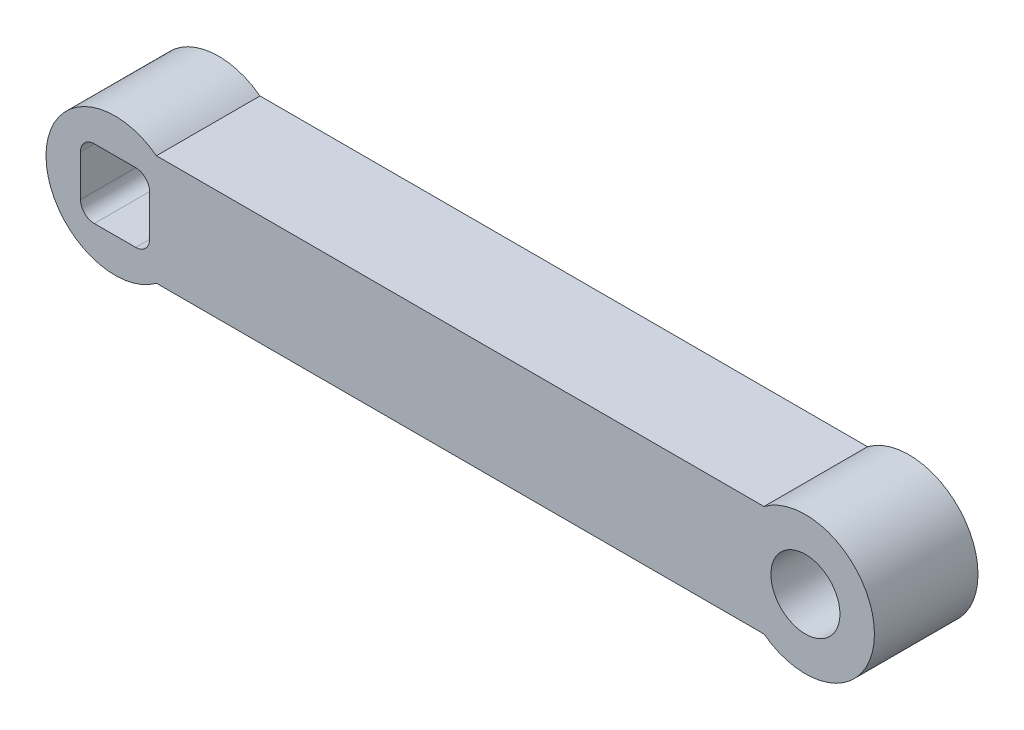
ISO-10303-21;
HEADER;
FILE_DESCRIPTION(('STEP AP214'),'2;1');
FILE_NAME('part.step','',(''),(''),'','','');
FILE_SCHEMA(('AUTOMOTIVE_DESIGN { 1 0 10303 214 1 1 1 1 }'));
ENDSEC;
DATA;
#1=APPLICATION_CONTEXT('core data for automotive mechanical design processes');
#2=APPLICATION_PROTOCOL_DEFINITION('international standard','automotive_design',2000,#1);
#3=PRODUCT_CONTEXT('',#1,'mechanical');
#4=PRODUCT('Part','Part','',(#3));
#5=PRODUCT_RELATED_PRODUCT_CATEGORY('part','',(#4));
#6=PRODUCT_DEFINITION_FORMATION('','',#4);
#7=PRODUCT_DEFINITION_CONTEXT('part definition',#1,'design');
#8=PRODUCT_DEFINITION('design','',#6,#7);
#9=PRODUCT_DEFINITION_SHAPE('','',#8);
#10=(LENGTH_UNIT() NAMED_UNIT(*) SI_UNIT(.MILLI.,.METRE.));
#11=(NAMED_UNIT(*) PLANE_ANGLE_UNIT() SI_UNIT($,.RADIAN.));
#12=(NAMED_UNIT(*) SI_UNIT($,.STERADIAN.) SOLID_ANGLE_UNIT());
#13=UNCERTAINTY_MEASURE_WITH_UNIT(LENGTH_MEASURE(1.E-05),#10,'distance_accuracy_value','');
#14=(GEOMETRIC_REPRESENTATION_CONTEXT(3) GLOBAL_UNCERTAINTY_ASSIGNED_CONTEXT((#13)) GLOBAL_UNIT_ASSIGNED_CONTEXT((#10,
#11,#12)) REPRESENTATION_CONTEXT('',''));
#15=CARTESIAN_POINT('',(0.,0.,0.));
#16=DIRECTION('',(0.,0.,1.));
#17=DIRECTION('',(1.,0.,0.));
#18=AXIS2_PLACEMENT_3D('',#15,#16,#17);
#19=CARTESIAN_POINT('',(0.,0.,7.5));
#20=DIRECTION('',(0.,0.,1.));
#21=DIRECTION('',(1.,0.,0.));
#22=AXIS2_PLACEMENT_3D('',#19,#20,#21);
#23=PLANE('',#22);
#24=CARTESIAN_POINT('',(0.,0.,7.5));
#25=DIRECTION('',(0.,0.,1.));
#26=DIRECTION('',(1.,0.,0.));
#27=AXIS2_PLACEMENT_3D('',#24,#25,#26);
#28=CIRCLE('',#27,5.);
#29=CARTESIAN_POINT('',(-3.00000000000002,-3.99999999999998,7.5));
#30=VERTEX_POINT('',#29);
#31=CARTESIAN_POINT('',(-3.00000000000002,3.99999999999998,7.5));
#32=VERTEX_POINT('',#31);
#33=EDGE_CURVE('E197',#30,#32,#28,.T.);
#34=ORIENTED_EDGE('',*,*,#33,.T.);
#35=DIRECTION('',(-1.,0.,0.));
#36=VECTOR('',#35,1.);
#37=CARTESIAN_POINT('',(-47.,3.99999999999998,7.5));
#38=LINE('',#37,#36);
#39=CARTESIAN_POINT('',(-47.,3.99999999999998,7.5));
#40=VERTEX_POINT('',#39);
#41=EDGE_CURVE('E200',#32,#40,#38,.T.);
#42=ORIENTED_EDGE('',*,*,#41,.T.);
#43=CARTESIAN_POINT('',(-50.,0.,7.5));
#44=DIRECTION('',(0.,0.,1.));
#45=DIRECTION('',(1.,0.,0.));
#46=AXIS2_PLACEMENT_3D('',#43,#44,#45);
#47=CIRCLE('',#46,5.);
#48=CARTESIAN_POINT('',(-47.,-3.99999999999999,7.5));
#49=VERTEX_POINT('',#48);
#50=EDGE_CURVE('E203',#40,#49,#47,.T.);
#51=ORIENTED_EDGE('',*,*,#50,.T.);
#52=DIRECTION('',(1.,0.,0.));
#53=VECTOR('',#52,1.);
#54=CARTESIAN_POINT('',(-47.,-3.99999999999999,7.5));
#55=LINE('',#54,#53);
#56=EDGE_CURVE('E205',#49,#30,#55,.T.);
#57=ORIENTED_EDGE('',*,*,#56,.T.);
#58=EDGE_LOOP('',(#34,#42,#51,#57));
#59=FACE_BOUND('',#58,.T.);
#60=CARTESIAN_POINT('',(0.,0.,7.5));
#61=DIRECTION('',(0.,0.,1.));
#62=DIRECTION('',(1.,0.,0.));
#63=AXIS2_PLACEMENT_3D('',#60,#61,#62);
#64=CIRCLE('',#63,2.5);
#65=CARTESIAN_POINT('',(2.5,0.,7.5));
#66=VERTEX_POINT('',#65);
#67=EDGE_CURVE('E191',#66,#66,#64,.T.);
#68=ORIENTED_EDGE('',*,*,#67,.F.);
#69=EDGE_LOOP('',(#68));
#70=FACE_BOUND('',#69,.T.);
#71=DIRECTION('',(0.,1.,0.));
#72=VECTOR('',#71,1.);
#73=CARTESIAN_POINT('',(-47.5,-1.50000000000001,7.5));
#74=LINE('',#73,#72);
#75=CARTESIAN_POINT('',(-47.5,-1.50000000000001,7.5));
#76=VERTEX_POINT('',#75);
#77=CARTESIAN_POINT('',(-47.5,1.49999999999999,7.5));
#78=VERTEX_POINT('',#77);
#79=EDGE_CURVE('E134',#76,#78,#74,.T.);
#80=ORIENTED_EDGE('',*,*,#79,.F.);
#81=CARTESIAN_POINT('',(-48.5,-1.50000000000001,7.5));
#82=DIRECTION('',(0.,0.,1.));
#83=DIRECTION('',(1.,0.,0.));
#84=AXIS2_PLACEMENT_3D('',#81,#82,#83);
#85=CIRCLE('',#84,1.);
#86=CARTESIAN_POINT('',(-48.5,-2.50000000000001,7.5));
#87=VERTEX_POINT('',#86);
#88=EDGE_CURVE('E126',#87,#76,#85,.T.);
#89=ORIENTED_EDGE('',*,*,#88,.F.);
#90=DIRECTION('',(1.,0.,0.));
#91=VECTOR('',#90,1.);
#92=CARTESIAN_POINT('',(-51.5,-2.50000000000001,7.5));
#93=LINE('',#92,#91);
#94=CARTESIAN_POINT('',(-51.5,-2.50000000000001,7.5));
#95=VERTEX_POINT('',#94);
#96=EDGE_CURVE('E159',#95,#87,#93,.T.);
#97=ORIENTED_EDGE('',*,*,#96,.F.);
#98=CARTESIAN_POINT('',(-51.5,-1.50000000000001,7.5));
#99=DIRECTION('',(0.,0.,1.));
#100=DIRECTION('',(-1.,0.,0.));
#101=AXIS2_PLACEMENT_3D('',#98,#99,#100);
#102=CIRCLE('',#101,1.);
#103=CARTESIAN_POINT('',(-52.5,-1.50000000000001,7.5));
#104=VERTEX_POINT('',#103);
#105=EDGE_CURVE('E157',#104,#95,#102,.T.);
#106=ORIENTED_EDGE('',*,*,#105,.F.);
#107=DIRECTION('',(0.,-1.,0.));
#108=VECTOR('',#107,1.);
#109=CARTESIAN_POINT('',(-52.5,-1.50000000000001,7.5));
#110=LINE('',#109,#108);
#111=CARTESIAN_POINT('',(-52.5,1.49999999999999,7.5));
#112=VERTEX_POINT('',#111);
#113=EDGE_CURVE('E155',#112,#104,#110,.T.);
#114=ORIENTED_EDGE('',*,*,#113,.F.);
#115=CARTESIAN_POINT('',(-51.5,1.49999999999999,7.5));
#116=DIRECTION('',(0.,0.,1.));
#117=DIRECTION('',(-1.,0.,0.));
#118=AXIS2_PLACEMENT_3D('',#115,#116,#117);
#119=CIRCLE('',#118,1.);
#120=CARTESIAN_POINT('',(-51.5,2.49999999999999,7.5));
#121=VERTEX_POINT('',#120);
#122=EDGE_CURVE('E153',#121,#112,#119,.T.);
#123=ORIENTED_EDGE('',*,*,#122,.F.);
#124=DIRECTION('',(-1.,0.,0.));
#125=VECTOR('',#124,1.);
#126=CARTESIAN_POINT('',(-51.5,2.49999999999999,7.5));
#127=LINE('',#126,#125);
#128=CARTESIAN_POINT('',(-48.5,2.49999999999999,7.5));
#129=VERTEX_POINT('',#128);
#130=EDGE_CURVE('E149',#129,#121,#127,.T.);
#131=ORIENTED_EDGE('',*,*,#130,.F.);
#132=CARTESIAN_POINT('',(-48.5,1.49999999999999,7.5));
#133=DIRECTION('',(0.,0.,1.));
#134=DIRECTION('',(-1.,0.,0.));
#135=AXIS2_PLACEMENT_3D('',#132,#133,#134);
#136=CIRCLE('',#135,1.);
#137=EDGE_CURVE('E147',#78,#129,#136,.T.);
#138=ORIENTED_EDGE('',*,*,#137,.F.);
#139=EDGE_LOOP('',(#80,#89,#97,#106,#114,#123,#131,#138));
#140=FACE_BOUND('',#139,.T.);
#141=ADVANCED_FACE('F37',(#59,#70,#140),#23,.T.);
#142=CARTESIAN_POINT('',(0.,0.,0.));
#143=DIRECTION('',(0.,0.,1.));
#144=DIRECTION('',(1.,0.,0.));
#145=AXIS2_PLACEMENT_3D('',#142,#143,#144);
#146=PLANE('',#145);
#147=CARTESIAN_POINT('',(0.,0.,0.));
#148=DIRECTION('',(0.,0.,1.));
#149=DIRECTION('',(1.,0.,0.));
#150=AXIS2_PLACEMENT_3D('',#147,#148,#149);
#151=CIRCLE('',#150,2.5);
#152=CARTESIAN_POINT('',(2.5,0.,0.));
#153=VERTEX_POINT('',#152);
#154=EDGE_CURVE('E142',#153,#153,#151,.T.);
#155=ORIENTED_EDGE('',*,*,#154,.T.);
#156=EDGE_LOOP('',(#155));
#157=FACE_BOUND('',#156,.T.);
#158=CARTESIAN_POINT('',(0.,0.,0.));
#159=DIRECTION('',(0.,0.,1.));
#160=DIRECTION('',(1.,0.,0.));
#161=AXIS2_PLACEMENT_3D('',#158,#159,#160);
#162=CIRCLE('',#161,5.);
#163=CARTESIAN_POINT('',(-3.00000000000002,-3.99999999999998,0.));
#164=VERTEX_POINT('',#163);
#165=CARTESIAN_POINT('',(-3.00000000000002,3.99999999999998,0.));
#166=VERTEX_POINT('',#165);
#167=EDGE_CURVE('E194',#164,#166,#162,.T.);
#168=ORIENTED_EDGE('',*,*,#167,.F.);
#169=DIRECTION('',(1.,0.,0.));
#170=VECTOR('',#169,1.);
#171=CARTESIAN_POINT('',(-47.,-3.99999999999999,0.));
#172=LINE('',#171,#170);
#173=CARTESIAN_POINT('',(-47.,-3.99999999999999,0.));
#174=VERTEX_POINT('',#173);
#175=EDGE_CURVE('E201',#174,#164,#172,.T.);
#176=ORIENTED_EDGE('',*,*,#175,.F.);
#177=CARTESIAN_POINT('',(-50.,0.,0.));
#178=DIRECTION('',(0.,0.,1.));
#179=DIRECTION('',(1.,0.,0.));
#180=AXIS2_PLACEMENT_3D('',#177,#178,#179);
#181=CIRCLE('',#180,5.);
#182=CARTESIAN_POINT('',(-47.,3.99999999999998,0.));
#183=VERTEX_POINT('',#182);
#184=EDGE_CURVE('E212',#183,#174,#181,.T.);
#185=ORIENTED_EDGE('',*,*,#184,.F.);
#186=DIRECTION('',(-1.,0.,0.));
#187=VECTOR('',#186,1.);
#188=CARTESIAN_POINT('',(-47.,3.99999999999998,0.));
#189=LINE('',#188,#187);
#190=EDGE_CURVE('E210',#166,#183,#189,.T.);
#191=ORIENTED_EDGE('',*,*,#190,.F.);
#192=EDGE_LOOP('',(#168,#176,#185,#191));
#193=FACE_BOUND('',#192,.T.);
#194=CARTESIAN_POINT('',(-48.5,-1.50000000000001,0.));
#195=DIRECTION('',(0.,0.,1.));
#196=DIRECTION('',(1.,0.,0.));
#197=AXIS2_PLACEMENT_3D('',#194,#195,#196);
#198=CIRCLE('',#197,1.);
#199=CARTESIAN_POINT('',(-48.5,-2.50000000000001,0.));
#200=VERTEX_POINT('',#199);
#201=CARTESIAN_POINT('',(-47.5,-1.50000000000001,0.));
#202=VERTEX_POINT('',#201);
#203=EDGE_CURVE('E60',#200,#202,#198,.T.);
#204=ORIENTED_EDGE('',*,*,#203,.T.);
#205=DIRECTION('',(0.,1.,0.));
#206=VECTOR('',#205,1.);
#207=CARTESIAN_POINT('',(-47.5,-1.50000000000001,0.));
#208=LINE('',#207,#206);
#209=CARTESIAN_POINT('',(-47.5,1.49999999999999,0.));
#210=VERTEX_POINT('',#209);
#211=EDGE_CURVE('E141',#202,#210,#208,.T.);
#212=ORIENTED_EDGE('',*,*,#211,.T.);
#213=CARTESIAN_POINT('',(-48.5,1.49999999999999,0.));
#214=DIRECTION('',(0.,0.,1.));
#215=DIRECTION('',(-1.,0.,0.));
#216=AXIS2_PLACEMENT_3D('',#213,#214,#215);
#217=CIRCLE('',#216,1.);
#218=CARTESIAN_POINT('',(-48.5,2.49999999999999,0.));
#219=VERTEX_POINT('',#218);
#220=EDGE_CURVE('E163',#210,#219,#217,.T.);
#221=ORIENTED_EDGE('',*,*,#220,.T.);
#222=DIRECTION('',(-1.,0.,0.));
#223=VECTOR('',#222,1.);
#224=CARTESIAN_POINT('',(-51.5,2.49999999999999,0.));
#225=LINE('',#224,#223);
#226=CARTESIAN_POINT('',(-51.5,2.49999999999999,0.));
#227=VERTEX_POINT('',#226);
#228=EDGE_CURVE('E166',#219,#227,#225,.T.);
#229=ORIENTED_EDGE('',*,*,#228,.T.);
#230=CARTESIAN_POINT('',(-51.5,1.49999999999999,0.));
#231=DIRECTION('',(0.,0.,1.));
#232=DIRECTION('',(-1.,0.,0.));
#233=AXIS2_PLACEMENT_3D('',#230,#231,#232);
#234=CIRCLE('',#233,1.);
#235=CARTESIAN_POINT('',(-52.5,1.49999999999999,0.));
#236=VERTEX_POINT('',#235);
#237=EDGE_CURVE('E169',#227,#236,#234,.T.);
#238=ORIENTED_EDGE('',*,*,#237,.T.);
#239=DIRECTION('',(0.,-1.,0.));
#240=VECTOR('',#239,1.);
#241=CARTESIAN_POINT('',(-52.5,-1.50000000000001,0.));
#242=LINE('',#241,#240);
#243=CARTESIAN_POINT('',(-52.5,-1.50000000000001,0.));
#244=VERTEX_POINT('',#243);
#245=EDGE_CURVE('E172',#236,#244,#242,.T.);
#246=ORIENTED_EDGE('',*,*,#245,.T.);
#247=CARTESIAN_POINT('',(-51.5,-1.50000000000001,0.));
#248=DIRECTION('',(0.,0.,1.));
#249=DIRECTION('',(-1.,0.,0.));
#250=AXIS2_PLACEMENT_3D('',#247,#248,#249);
#251=CIRCLE('',#250,1.);
#252=CARTESIAN_POINT('',(-51.5,-2.50000000000001,0.));
#253=VERTEX_POINT('',#252);
#254=EDGE_CURVE('E175',#244,#253,#251,.T.);
#255=ORIENTED_EDGE('',*,*,#254,.T.);
#256=DIRECTION('',(1.,0.,0.));
#257=VECTOR('',#256,1.);
#258=CARTESIAN_POINT('',(-51.5,-2.50000000000001,0.));
#259=LINE('',#258,#257);
#260=EDGE_CURVE('E135',#253,#200,#259,.T.);
#261=ORIENTED_EDGE('',*,*,#260,.T.);
#262=EDGE_LOOP('',(#204,#212,#221,#229,#238,#246,#255,#261));
#263=FACE_BOUND('',#262,.T.);
#264=ADVANCED_FACE('F230',(#157,#193,#263),#146,.F.);
#265=CARTESIAN_POINT('',(0.,0.,7.5));
#266=DIRECTION('',(0.,0.,-1.));
#267=DIRECTION('',(-1.,0.,0.));
#268=AXIS2_PLACEMENT_3D('',#265,#266,#267);
#269=CYLINDRICAL_SURFACE('',#268,5.);
#270=ORIENTED_EDGE('',*,*,#167,.T.);
#271=DIRECTION('',(0.,0.,-1.));
#272=VECTOR('',#271,1.);
#273=CARTESIAN_POINT('',(-3.00000000000002,3.99999999999998,7.5));
#274=LINE('',#273,#272);
#275=EDGE_CURVE('E11',#32,#166,#274,.T.);
#276=ORIENTED_EDGE('',*,*,#275,.F.);
#277=ORIENTED_EDGE('',*,*,#33,.F.);
#278=DIRECTION('',(0.,0.,-1.));
#279=VECTOR('',#278,1.);
#280=CARTESIAN_POINT('',(-3.00000000000002,-3.99999999999998,7.5));
#281=LINE('',#280,#279);
#282=EDGE_CURVE('E207',#30,#164,#281,.T.);
#283=ORIENTED_EDGE('',*,*,#282,.T.);
#284=EDGE_LOOP('',(#270,#276,#277,#283));
#285=FACE_BOUND('',#284,.T.);
#286=ADVANCED_FACE('F39',(#285),#269,.T.);
#287=CARTESIAN_POINT('',(-47.,3.99999999999998,7.5));
#288=DIRECTION('',(0.,-1.,0.));
#289=DIRECTION('',(1.,0.,0.));
#290=AXIS2_PLACEMENT_3D('',#287,#288,#289);
#291=PLANE('',#290);
#292=ORIENTED_EDGE('',*,*,#190,.T.);
#293=DIRECTION('',(0.,0.,-1.));
#294=VECTOR('',#293,1.);
#295=CARTESIAN_POINT('',(-47.,3.99999999999998,7.5));
#296=LINE('',#295,#294);
#297=EDGE_CURVE('E45',#40,#183,#296,.T.);
#298=ORIENTED_EDGE('',*,*,#297,.F.);
#299=ORIENTED_EDGE('',*,*,#41,.F.);
#300=ORIENTED_EDGE('',*,*,#275,.T.);
#301=EDGE_LOOP('',(#292,#298,#299,#300));
#302=FACE_BOUND('',#301,.T.);
#303=ADVANCED_FACE('F241',(#302),#291,.F.);
#304=CARTESIAN_POINT('',(-50.,0.,7.5));
#305=DIRECTION('',(0.,0.,-1.));
#306=DIRECTION('',(-1.,0.,0.));
#307=AXIS2_PLACEMENT_3D('',#304,#305,#306);
#308=CYLINDRICAL_SURFACE('',#307,5.);
#309=ORIENTED_EDGE('',*,*,#184,.T.);
#310=DIRECTION('',(0.,0.,-1.));
#311=VECTOR('',#310,1.);
#312=CARTESIAN_POINT('',(-47.,-3.99999999999999,7.5));
#313=LINE('',#312,#311);
#314=EDGE_CURVE('E217',#49,#174,#313,.T.);
#315=ORIENTED_EDGE('',*,*,#314,.F.);
#316=ORIENTED_EDGE('',*,*,#50,.F.);
#317=ORIENTED_EDGE('',*,*,#297,.T.);
#318=EDGE_LOOP('',(#309,#315,#316,#317));
#319=FACE_BOUND('',#318,.T.);
#320=ADVANCED_FACE('F224',(#319),#308,.T.);
#321=CARTESIAN_POINT('',(-47.,-3.99999999999999,7.5));
#322=DIRECTION('',(0.,1.,0.));
#323=DIRECTION('',(-1.,0.,0.));
#324=AXIS2_PLACEMENT_3D('',#321,#322,#323);
#325=PLANE('',#324);
#326=ORIENTED_EDGE('',*,*,#175,.T.);
#327=ORIENTED_EDGE('',*,*,#282,.F.);
#328=ORIENTED_EDGE('',*,*,#56,.F.);
#329=ORIENTED_EDGE('',*,*,#314,.T.);
#330=EDGE_LOOP('',(#326,#327,#328,#329));
#331=FACE_BOUND('',#330,.T.);
#332=ADVANCED_FACE('F234',(#331),#325,.F.);
#333=CARTESIAN_POINT('',(0.,0.,7.5));
#334=DIRECTION('',(0.,0.,-1.));
#335=DIRECTION('',(-1.,0.,0.));
#336=AXIS2_PLACEMENT_3D('',#333,#334,#335);
#337=CYLINDRICAL_SURFACE('',#336,2.5);
#338=ORIENTED_EDGE('',*,*,#67,.T.);
#339=EDGE_LOOP('',(#338));
#340=FACE_BOUND('',#339,.T.);
#341=ORIENTED_EDGE('',*,*,#154,.F.);
#342=EDGE_LOOP('',(#341));
#343=FACE_BOUND('',#342,.T.);
#344=ADVANCED_FACE('F256',(#340,#343),#337,.F.);
#345=CARTESIAN_POINT('',(-48.5,-1.50000000000001,7.5));
#346=DIRECTION('',(0.,0.,-1.));
#347=DIRECTION('',(-1.,0.,0.));
#348=AXIS2_PLACEMENT_3D('',#345,#346,#347);
#349=CYLINDRICAL_SURFACE('',#348,1.);
#350=ORIENTED_EDGE('',*,*,#203,.F.);
#351=DIRECTION('',(0.,0.,-1.));
#352=VECTOR('',#351,1.);
#353=CARTESIAN_POINT('',(-48.5,-2.50000000000001,7.5));
#354=LINE('',#353,#352);
#355=EDGE_CURVE('E130',#87,#200,#354,.T.);
#356=ORIENTED_EDGE('',*,*,#355,.F.);
#357=ORIENTED_EDGE('',*,*,#88,.T.);
#358=DIRECTION('',(0.,0.,-1.));
#359=VECTOR('',#358,1.);
#360=CARTESIAN_POINT('',(-47.5,-1.50000000000001,7.5));
#361=LINE('',#360,#359);
#362=EDGE_CURVE('E129',#76,#202,#361,.T.);
#363=ORIENTED_EDGE('',*,*,#362,.T.);
#364=EDGE_LOOP('',(#350,#356,#357,#363));
#365=FACE_BOUND('',#364,.T.);
#366=ADVANCED_FACE('F128',(#365),#349,.F.);
#367=CARTESIAN_POINT('',(-47.5,-1.50000000000001,7.5));
#368=DIRECTION('',(-1.,0.,0.));
#369=DIRECTION('',(0.,0.,1.));
#370=AXIS2_PLACEMENT_3D('',#367,#368,#369);
#371=PLANE('',#370);
#372=ORIENTED_EDGE('',*,*,#211,.F.);
#373=ORIENTED_EDGE('',*,*,#362,.F.);
#374=ORIENTED_EDGE('',*,*,#79,.T.);
#375=DIRECTION('',(0.,0.,-1.));
#376=VECTOR('',#375,1.);
#377=CARTESIAN_POINT('',(-47.5,1.49999999999999,7.5));
#378=LINE('',#377,#376);
#379=EDGE_CURVE('E143',#78,#210,#378,.T.);
#380=ORIENTED_EDGE('',*,*,#379,.T.);
#381=EDGE_LOOP('',(#372,#373,#374,#380));
#382=FACE_BOUND('',#381,.T.);
#383=ADVANCED_FACE('F138',(#382),#371,.T.);
#384=CARTESIAN_POINT('',(-48.5,1.49999999999999,7.5));
#385=DIRECTION('',(0.,0.,-1.));
#386=DIRECTION('',(-1.,0.,0.));
#387=AXIS2_PLACEMENT_3D('',#384,#385,#386);
#388=CYLINDRICAL_SURFACE('',#387,1.);
#389=ORIENTED_EDGE('',*,*,#220,.F.);
#390=ORIENTED_EDGE('',*,*,#379,.F.);
#391=ORIENTED_EDGE('',*,*,#137,.T.);
#392=DIRECTION('',(0.,0.,-1.));
#393=VECTOR('',#392,1.);
#394=CARTESIAN_POINT('',(-48.5,2.49999999999999,7.5));
#395=LINE('',#394,#393);
#396=EDGE_CURVE('E188',#129,#219,#395,.T.);
#397=ORIENTED_EDGE('',*,*,#396,.T.);
#398=EDGE_LOOP('',(#389,#390,#391,#397));
#399=FACE_BOUND('',#398,.T.);
#400=ADVANCED_FACE('F273',(#399),#388,.F.);
#401=CARTESIAN_POINT('',(-51.5,2.49999999999999,7.5));
#402=DIRECTION('',(0.,-1.,0.));
#403=DIRECTION('',(0.,0.,-1.));
#404=AXIS2_PLACEMENT_3D('',#401,#402,#403);
#405=PLANE('',#404);
#406=ORIENTED_EDGE('',*,*,#228,.F.);
#407=ORIENTED_EDGE('',*,*,#396,.F.);
#408=ORIENTED_EDGE('',*,*,#130,.T.);
#409=DIRECTION('',(0.,0.,-1.));
#410=VECTOR('',#409,1.);
#411=CARTESIAN_POINT('',(-51.5,2.49999999999999,7.5));
#412=LINE('',#411,#410);
#413=EDGE_CURVE('E186',#121,#227,#412,.T.);
#414=ORIENTED_EDGE('',*,*,#413,.T.);
#415=EDGE_LOOP('',(#406,#407,#408,#414));
#416=FACE_BOUND('',#415,.T.);
#417=ADVANCED_FACE('F278',(#416),#405,.T.);
#418=CARTESIAN_POINT('',(-51.5,1.49999999999999,7.5));
#419=DIRECTION('',(0.,0.,-1.));
#420=DIRECTION('',(-1.,0.,0.));
#421=AXIS2_PLACEMENT_3D('',#418,#419,#420);
#422=CYLINDRICAL_SURFACE('',#421,1.);
#423=ORIENTED_EDGE('',*,*,#237,.F.);
#424=ORIENTED_EDGE('',*,*,#413,.F.);
#425=ORIENTED_EDGE('',*,*,#122,.T.);
#426=DIRECTION('',(0.,0.,-1.));
#427=VECTOR('',#426,1.);
#428=CARTESIAN_POINT('',(-52.5,1.49999999999999,7.5));
#429=LINE('',#428,#427);
#430=EDGE_CURVE('E184',#112,#236,#429,.T.);
#431=ORIENTED_EDGE('',*,*,#430,.T.);
#432=EDGE_LOOP('',(#423,#424,#425,#431));
#433=FACE_BOUND('',#432,.T.);
#434=ADVANCED_FACE('F282',(#433),#422,.F.);
#435=CARTESIAN_POINT('',(-52.5,-1.50000000000001,7.5));
#436=DIRECTION('',(1.,0.,0.));
#437=DIRECTION('',(0.,0.,-1.));
#438=AXIS2_PLACEMENT_3D('',#435,#436,#437);
#439=PLANE('',#438);
#440=ORIENTED_EDGE('',*,*,#245,.F.);
#441=ORIENTED_EDGE('',*,*,#430,.F.);
#442=ORIENTED_EDGE('',*,*,#113,.T.);
#443=DIRECTION('',(0.,0.,-1.));
#444=VECTOR('',#443,1.);
#445=CARTESIAN_POINT('',(-52.5,-1.50000000000001,7.5));
#446=LINE('',#445,#444);
#447=EDGE_CURVE('E182',#104,#244,#446,.T.);
#448=ORIENTED_EDGE('',*,*,#447,.T.);
#449=EDGE_LOOP('',(#440,#441,#442,#448));
#450=FACE_BOUND('',#449,.T.);
#451=ADVANCED_FACE('F286',(#450),#439,.T.);
#452=CARTESIAN_POINT('',(-51.5,-1.50000000000001,7.5));
#453=DIRECTION('',(0.,0.,-1.));
#454=DIRECTION('',(-1.,0.,0.));
#455=AXIS2_PLACEMENT_3D('',#452,#453,#454);
#456=CYLINDRICAL_SURFACE('',#455,1.);
#457=ORIENTED_EDGE('',*,*,#254,.F.);
#458=ORIENTED_EDGE('',*,*,#447,.F.);
#459=ORIENTED_EDGE('',*,*,#105,.T.);
#460=DIRECTION('',(0.,0.,-1.));
#461=VECTOR('',#460,1.);
#462=CARTESIAN_POINT('',(-51.5,-2.50000000000001,7.5));
#463=LINE('',#462,#461);
#464=EDGE_CURVE('E52',#95,#253,#463,.T.);
#465=ORIENTED_EDGE('',*,*,#464,.T.);
#466=EDGE_LOOP('',(#457,#458,#459,#465));
#467=FACE_BOUND('',#466,.T.);
#468=ADVANCED_FACE('F290',(#467),#456,.F.);
#469=CARTESIAN_POINT('',(-51.5,-2.50000000000001,7.5));
#470=DIRECTION('',(0.,1.,0.));
#471=DIRECTION('',(0.,0.,1.));
#472=AXIS2_PLACEMENT_3D('',#469,#470,#471);
#473=PLANE('',#472);
#474=ORIENTED_EDGE('',*,*,#260,.F.);
#475=ORIENTED_EDGE('',*,*,#464,.F.);
#476=ORIENTED_EDGE('',*,*,#96,.T.);
#477=ORIENTED_EDGE('',*,*,#355,.T.);
#478=EDGE_LOOP('',(#474,#475,#476,#477));
#479=FACE_BOUND('',#478,.T.);
#480=ADVANCED_FACE('F294',(#479),#473,.T.);
#481=CLOSED_SHELL('',(#141,#264,#286,#303,#320,#332,#344,#366,#383,#400,#417,#434,#451,#468,#480));
#482=MANIFOLD_SOLID_BREP('B2',#481);
#483=ADVANCED_BREP_SHAPE_REPRESENTATION('',(#18,#482),#14);
#484=SHAPE_DEFINITION_REPRESENTATION(#9,#483);
ENDSEC;
END-ISO-10303-21;
